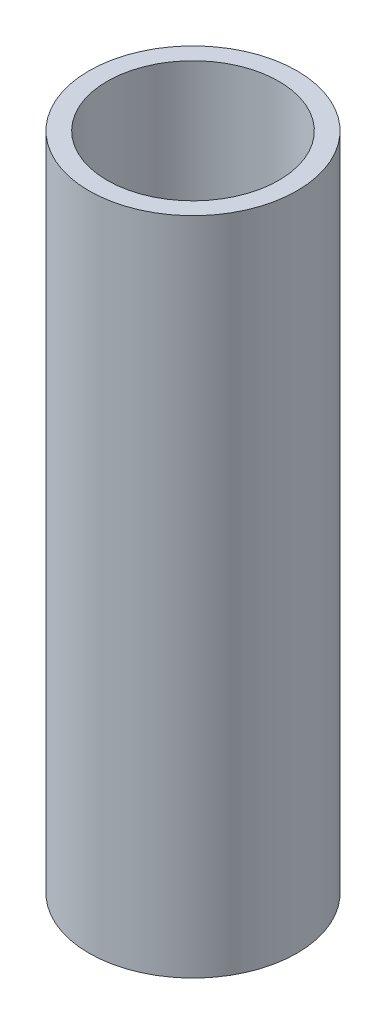
ISO-10303-21;
HEADER;
FILE_DESCRIPTION(('STEP AP214'),'2;1');
FILE_NAME('part.step','',(''),(''),'','','');
FILE_SCHEMA(('AUTOMOTIVE_DESIGN { 1 0 10303 214 1 1 1 1 }'));
ENDSEC;
DATA;
#1=APPLICATION_CONTEXT('core data for automotive mechanical design processes');
#2=APPLICATION_PROTOCOL_DEFINITION('international standard','automotive_design',2000,#1);
#3=PRODUCT_CONTEXT('',#1,'mechanical');
#4=PRODUCT('Part','Part','',(#3));
#5=PRODUCT_RELATED_PRODUCT_CATEGORY('part','',(#4));
#6=PRODUCT_DEFINITION_FORMATION('','',#4);
#7=PRODUCT_DEFINITION_CONTEXT('part definition',#1,'design');
#8=PRODUCT_DEFINITION('design','',#6,#7);
#9=PRODUCT_DEFINITION_SHAPE('','',#8);
#10=(LENGTH_UNIT() NAMED_UNIT(*) SI_UNIT(.MILLI.,.METRE.));
#11=(NAMED_UNIT(*) PLANE_ANGLE_UNIT() SI_UNIT($,.RADIAN.));
#12=(NAMED_UNIT(*) SI_UNIT($,.STERADIAN.) SOLID_ANGLE_UNIT());
#13=UNCERTAINTY_MEASURE_WITH_UNIT(LENGTH_MEASURE(1.E-05),#10,'distance_accuracy_value','');
#14=(GEOMETRIC_REPRESENTATION_CONTEXT(3) GLOBAL_UNCERTAINTY_ASSIGNED_CONTEXT((#13)) GLOBAL_UNIT_ASSIGNED_CONTEXT((#10,
#11,#12)) REPRESENTATION_CONTEXT('',''));
#15=CARTESIAN_POINT('',(0.,0.,0.));
#16=DIRECTION('',(0.,0.,1.));
#17=DIRECTION('',(1.,0.,0.));
#18=AXIS2_PLACEMENT_3D('',#15,#16,#17);
#19=CARTESIAN_POINT('',(0.,80.,0.));
#20=DIRECTION('',(0.,-1.,0.));
#21=DIRECTION('',(0.,0.,-1.));
#22=AXIS2_PLACEMENT_3D('',#19,#20,#21);
#23=CYLINDRICAL_SURFACE('',#22,12.6);
#24=CARTESIAN_POINT('',(0.,80.,0.));
#25=DIRECTION('',(0.,1.,0.));
#26=DIRECTION('',(0.,0.,1.));
#27=AXIS2_PLACEMENT_3D('',#24,#25,#26);
#28=CIRCLE('',#27,12.6);
#29=CARTESIAN_POINT('',(0.,80.,12.6));
#30=VERTEX_POINT('',#29);
#31=EDGE_CURVE('E10',#30,#30,#28,.T.);
#32=ORIENTED_EDGE('',*,*,#31,.F.);
#33=EDGE_LOOP('',(#32));
#34=FACE_BOUND('',#33,.T.);
#35=CARTESIAN_POINT('',(0.,0.,0.));
#36=DIRECTION('',(0.,1.,0.));
#37=DIRECTION('',(0.,0.,1.));
#38=AXIS2_PLACEMENT_3D('',#35,#36,#37);
#39=CIRCLE('',#38,12.6);
#40=CARTESIAN_POINT('',(0.,0.,12.6));
#41=VERTEX_POINT('',#40);
#42=EDGE_CURVE('E40',#41,#41,#39,.T.);
#43=ORIENTED_EDGE('',*,*,#42,.T.);
#44=EDGE_LOOP('',(#43));
#45=FACE_BOUND('',#44,.T.);
#46=ADVANCED_FACE('F37',(#34,#45),#23,.T.);
#47=CARTESIAN_POINT('',(0.,80.,0.));
#48=DIRECTION('',(0.,1.,0.));
#49=DIRECTION('',(0.,0.,1.));
#50=AXIS2_PLACEMENT_3D('',#47,#48,#49);
#51=PLANE('',#50);
#52=CARTESIAN_POINT('',(0.,80.,0.));
#53=DIRECTION('',(0.,1.,0.));
#54=DIRECTION('',(0.,0.,1.));
#55=AXIS2_PLACEMENT_3D('',#52,#53,#54);
#56=CIRCLE('',#55,10.4);
#57=CARTESIAN_POINT('',(0.,80.,10.4));
#58=VERTEX_POINT('',#57);
#59=EDGE_CURVE('E49',#58,#58,#56,.T.);
#60=ORIENTED_EDGE('',*,*,#59,.F.);
#61=EDGE_LOOP('',(#60));
#62=FACE_BOUND('',#61,.T.);
#63=ORIENTED_EDGE('',*,*,#31,.T.);
#64=EDGE_LOOP('',(#63));
#65=FACE_BOUND('',#64,.T.);
#66=ADVANCED_FACE('F62',(#62,#65),#51,.T.);
#67=CARTESIAN_POINT('',(0.,0.,0.));
#68=DIRECTION('',(0.,1.,0.));
#69=DIRECTION('',(0.,0.,1.));
#70=AXIS2_PLACEMENT_3D('',#67,#68,#69);
#71=PLANE('',#70);
#72=CARTESIAN_POINT('',(0.,0.,0.));
#73=DIRECTION('',(0.,1.,0.));
#74=DIRECTION('',(0.,0.,1.));
#75=AXIS2_PLACEMENT_3D('',#72,#73,#74);
#76=CIRCLE('',#75,10.4);
#77=CARTESIAN_POINT('',(0.,0.,10.4));
#78=VERTEX_POINT('',#77);
#79=EDGE_CURVE('E51',#78,#78,#76,.T.);
#80=ORIENTED_EDGE('',*,*,#79,.T.);
#81=EDGE_LOOP('',(#80));
#82=FACE_BOUND('',#81,.T.);
#83=ORIENTED_EDGE('',*,*,#42,.F.);
#84=EDGE_LOOP('',(#83));
#85=FACE_BOUND('',#84,.T.);
#86=ADVANCED_FACE('F64',(#82,#85),#71,.F.);
#87=CARTESIAN_POINT('',(0.,80.,0.));
#88=DIRECTION('',(0.,-1.,0.));
#89=DIRECTION('',(0.,0.,-1.));
#90=AXIS2_PLACEMENT_3D('',#87,#88,#89);
#91=CYLINDRICAL_SURFACE('',#90,10.4);
#92=ORIENTED_EDGE('',*,*,#59,.T.);
#93=EDGE_LOOP('',(#92));
#94=FACE_BOUND('',#93,.T.);
#95=ORIENTED_EDGE('',*,*,#79,.F.);
#96=EDGE_LOOP('',(#95));
#97=FACE_BOUND('',#96,.T.);
#98=ADVANCED_FACE('F59',(#94,#97),#91,.F.);
#99=CLOSED_SHELL('',(#46,#66,#86,#98));
#100=MANIFOLD_SOLID_BREP('B2',#99);
#101=ADVANCED_BREP_SHAPE_REPRESENTATION('',(#18,#100),#14);
#102=SHAPE_DEFINITION_REPRESENTATION(#9,#101);
ENDSEC;
END-ISO-10303-21;
